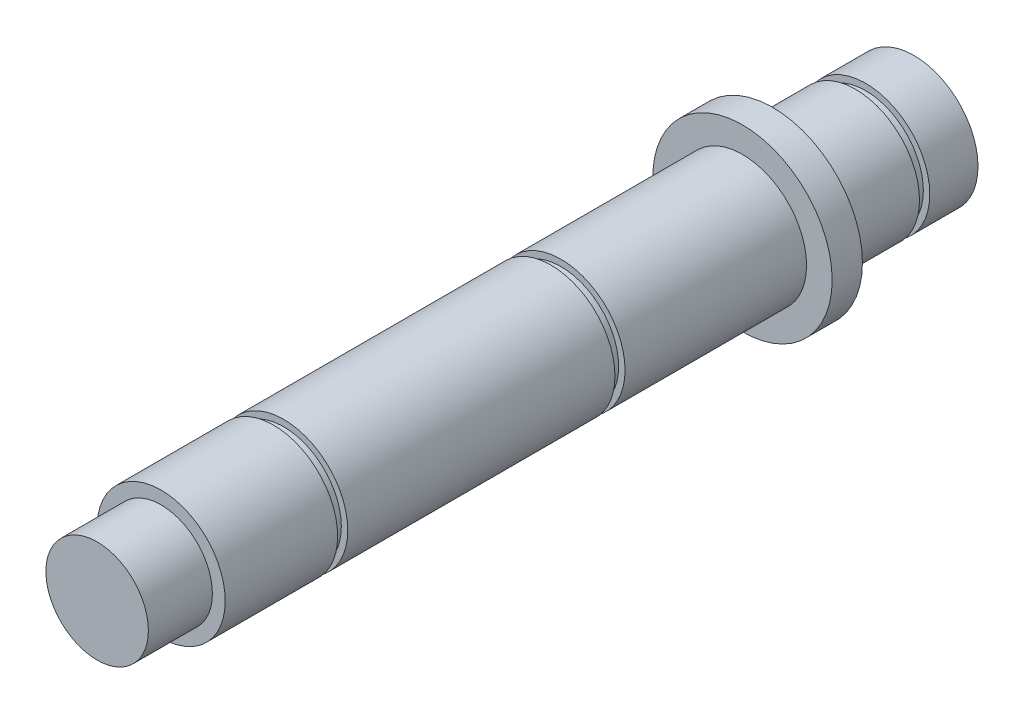
ISO-10303-21;
HEADER;
FILE_DESCRIPTION(('STEP AP214'),'2;1');
FILE_NAME('part.step','',(''),(''),'','','');
FILE_SCHEMA(('AUTOMOTIVE_DESIGN { 1 0 10303 214 1 1 1 1 }'));
ENDSEC;
DATA;
#1=APPLICATION_CONTEXT('core data for automotive mechanical design processes');
#2=APPLICATION_PROTOCOL_DEFINITION('international standard','automotive_design',2000,#1);
#3=PRODUCT_CONTEXT('',#1,'mechanical');
#4=PRODUCT('Part','Part','',(#3));
#5=PRODUCT_RELATED_PRODUCT_CATEGORY('part','',(#4));
#6=PRODUCT_DEFINITION_FORMATION('','',#4);
#7=PRODUCT_DEFINITION_CONTEXT('part definition',#1,'design');
#8=PRODUCT_DEFINITION('design','',#6,#7);
#9=PRODUCT_DEFINITION_SHAPE('','',#8);
#10=(LENGTH_UNIT() NAMED_UNIT(*) SI_UNIT(.MILLI.,.METRE.));
#11=(NAMED_UNIT(*) PLANE_ANGLE_UNIT() SI_UNIT($,.RADIAN.));
#12=(NAMED_UNIT(*) SI_UNIT($,.STERADIAN.) SOLID_ANGLE_UNIT());
#13=UNCERTAINTY_MEASURE_WITH_UNIT(LENGTH_MEASURE(1.E-05),#10,'distance_accuracy_value','');
#14=(GEOMETRIC_REPRESENTATION_CONTEXT(3) GLOBAL_UNCERTAINTY_ASSIGNED_CONTEXT((#13)) GLOBAL_UNIT_ASSIGNED_CONTEXT((#10,
#11,#12)) REPRESENTATION_CONTEXT('',''));
#15=CARTESIAN_POINT('',(0.,0.,0.));
#16=DIRECTION('',(0.,0.,1.));
#17=DIRECTION('',(1.,0.,0.));
#18=AXIS2_PLACEMENT_3D('',#15,#16,#17);
#19=CARTESIAN_POINT('',(0.,0.,-81.));
#20=DIRECTION('',(0.,0.,1.));
#21=DIRECTION('',(1.,0.,0.));
#22=AXIS2_PLACEMENT_3D('',#19,#20,#21);
#23=CYLINDRICAL_SURFACE('',#22,6.35);
#24=CARTESIAN_POINT('',(0.,0.,-64.));
#25=DIRECTION('',(0.,0.,1.));
#26=DIRECTION('',(1.,0.,0.));
#27=AXIS2_PLACEMENT_3D('',#24,#25,#26);
#28=CIRCLE('',#27,6.35);
#29=CARTESIAN_POINT('',(6.35,0.,-64.));
#30=VERTEX_POINT('',#29);
#31=EDGE_CURVE('E10',#30,#30,#28,.F.);
#32=ORIENTED_EDGE('',*,*,#31,.F.);
#33=EDGE_LOOP('',(#32));
#34=FACE_BOUND('',#33,.T.);
#35=CARTESIAN_POINT('',(0.,0.,-46.));
#36=DIRECTION('',(0.,0.,1.));
#37=DIRECTION('',(1.,0.,0.));
#38=AXIS2_PLACEMENT_3D('',#35,#36,#37);
#39=CIRCLE('',#38,6.35);
#40=CARTESIAN_POINT('',(6.35,0.,-46.));
#41=VERTEX_POINT('',#40);
#42=EDGE_CURVE('E35',#41,#41,#39,.F.);
#43=ORIENTED_EDGE('',*,*,#42,.T.);
#44=EDGE_LOOP('',(#43));
#45=FACE_BOUND('',#44,.T.);
#46=ADVANCED_FACE('F31',(#34,#45),#23,.T.);
#47=CARTESIAN_POINT('',(0.,0.,-75.2));
#48=DIRECTION('',(0.,0.,1.));
#49=DIRECTION('',(1.,0.,0.));
#50=AXIS2_PLACEMENT_3D('',#47,#48,#49);
#51=CIRCLE('',#50,6.35);
#52=CARTESIAN_POINT('',(6.35,0.,-75.2));
#53=VERTEX_POINT('',#52);
#54=EDGE_CURVE('E93',#53,#53,#51,.F.);
#55=ORIENTED_EDGE('',*,*,#54,.F.);
#56=EDGE_LOOP('',(#55));
#57=FACE_BOUND('',#56,.T.);
#58=CARTESIAN_POINT('',(0.,0.,-67.));
#59=DIRECTION('',(0.,0.,1.));
#60=DIRECTION('',(1.,0.,0.));
#61=AXIS2_PLACEMENT_3D('',#58,#59,#60);
#62=CIRCLE('',#61,6.35);
#63=CARTESIAN_POINT('',(6.35,0.,-67.));
#64=VERTEX_POINT('',#63);
#65=EDGE_CURVE('E48',#64,#64,#62,.F.);
#66=ORIENTED_EDGE('',*,*,#65,.T.);
#67=EDGE_LOOP('',(#66));
#68=FACE_BOUND('',#67,.T.);
#69=ADVANCED_FACE('F125',(#57,#68),#23,.T.);
#70=CARTESIAN_POINT('',(0.,0.,-81.));
#71=DIRECTION('',(0.,0.,1.));
#72=DIRECTION('',(1.,0.,0.));
#73=AXIS2_PLACEMENT_3D('',#70,#71,#72);
#74=CIRCLE('',#73,6.35);
#75=CARTESIAN_POINT('',(6.35,0.,-81.));
#76=VERTEX_POINT('',#75);
#77=EDGE_CURVE('E39',#76,#76,#74,.T.);
#78=ORIENTED_EDGE('',*,*,#77,.T.);
#79=EDGE_LOOP('',(#78));
#80=FACE_BOUND('',#79,.T.);
#81=CARTESIAN_POINT('',(0.,0.,-76.216));
#82=DIRECTION('',(0.,0.,1.));
#83=DIRECTION('',(1.,0.,0.));
#84=AXIS2_PLACEMENT_3D('',#81,#82,#83);
#85=CIRCLE('',#84,6.35);
#86=CARTESIAN_POINT('',(6.35,0.,-76.216));
#87=VERTEX_POINT('',#86);
#88=EDGE_CURVE('E44',#87,#87,#85,.F.);
#89=ORIENTED_EDGE('',*,*,#88,.T.);
#90=EDGE_LOOP('',(#89));
#91=FACE_BOUND('',#90,.T.);
#92=ADVANCED_FACE('F101',(#80,#91),#23,.T.);
#93=CARTESIAN_POINT('',(0.,0.,-81.));
#94=DIRECTION('',(0.,0.,1.));
#95=DIRECTION('',(1.,0.,0.));
#96=AXIS2_PLACEMENT_3D('',#93,#94,#95);
#97=PLANE('',#96);
#98=ORIENTED_EDGE('',*,*,#77,.F.);
#99=EDGE_LOOP('',(#98));
#100=FACE_BOUND('',#99,.T.);
#101=ADVANCED_FACE('F107',(#100),#97,.F.);
#102=CARTESIAN_POINT('',(0.0490374855015747,0.,-76.216));
#103=DIRECTION('',(0.,0.,1.));
#104=DIRECTION('',(1.,0.,0.));
#105=AXIS2_PLACEMENT_3D('',#102,#103,#104);
#106=PLANE('',#105);
#107=ORIENTED_EDGE('',*,*,#88,.F.);
#108=EDGE_LOOP('',(#107));
#109=FACE_BOUND('',#108,.T.);
#110=CARTESIAN_POINT('',(0.,0.,-76.216));
#111=DIRECTION('',(0.,0.,1.));
#112=DIRECTION('',(1.,0.,0.));
#113=AXIS2_PLACEMENT_3D('',#110,#111,#112);
#114=CIRCLE('',#113,5.715);
#115=CARTESIAN_POINT('',(5.715,0.,-76.216));
#116=VERTEX_POINT('',#115);
#117=EDGE_CURVE('E90',#116,#116,#114,.T.);
#118=ORIENTED_EDGE('',*,*,#117,.F.);
#119=EDGE_LOOP('',(#118));
#120=FACE_BOUND('',#119,.T.);
#121=ADVANCED_FACE('F103',(#109,#120),#106,.T.);
#122=CARTESIAN_POINT('',(0.0490374855015747,0.,-75.2));
#123=DIRECTION('',(0.,0.,1.));
#124=DIRECTION('',(1.,0.,0.));
#125=AXIS2_PLACEMENT_3D('',#122,#123,#124);
#126=PLANE('',#125);
#127=ORIENTED_EDGE('',*,*,#54,.T.);
#128=EDGE_LOOP('',(#127));
#129=FACE_BOUND('',#128,.T.);
#130=CARTESIAN_POINT('',(0.,0.,-75.2));
#131=DIRECTION('',(0.,0.,1.));
#132=DIRECTION('',(1.,0.,0.));
#133=AXIS2_PLACEMENT_3D('',#130,#131,#132);
#134=CIRCLE('',#133,5.715);
#135=CARTESIAN_POINT('',(5.715,0.,-75.2));
#136=VERTEX_POINT('',#135);
#137=EDGE_CURVE('E94',#136,#136,#134,.T.);
#138=ORIENTED_EDGE('',*,*,#137,.T.);
#139=EDGE_LOOP('',(#138));
#140=FACE_BOUND('',#139,.T.);
#141=ADVANCED_FACE('F106',(#129,#140),#126,.F.);
#142=CARTESIAN_POINT('',(0.,0.,-76.216));
#143=DIRECTION('',(0.,0.,1.));
#144=DIRECTION('',(1.,0.,0.));
#145=AXIS2_PLACEMENT_3D('',#142,#143,#144);
#146=CYLINDRICAL_SURFACE('',#145,5.715);
#147=ORIENTED_EDGE('',*,*,#117,.T.);
#148=EDGE_LOOP('',(#147));
#149=FACE_BOUND('',#148,.T.);
#150=ORIENTED_EDGE('',*,*,#137,.F.);
#151=EDGE_LOOP('',(#150));
#152=FACE_BOUND('',#151,.T.);
#153=ADVANCED_FACE('F111',(#149,#152),#146,.T.);
#154=CARTESIAN_POINT('',(0.,0.,-64.));
#155=DIRECTION('',(0.,0.,-1.));
#156=DIRECTION('',(-1.,0.,0.));
#157=AXIS2_PLACEMENT_3D('',#154,#155,#156);
#158=CYLINDRICAL_SURFACE('',#157,8.89);
#159=CARTESIAN_POINT('',(0.,0.,-64.));
#160=DIRECTION('',(0.,0.,1.));
#161=DIRECTION('',(1.,0.,0.));
#162=AXIS2_PLACEMENT_3D('',#159,#160,#161);
#163=CIRCLE('',#162,8.89);
#164=CARTESIAN_POINT('',(8.89,0.,-64.));
#165=VERTEX_POINT('',#164);
#166=EDGE_CURVE('E85',#165,#165,#163,.T.);
#167=ORIENTED_EDGE('',*,*,#166,.F.);
#168=EDGE_LOOP('',(#167));
#169=FACE_BOUND('',#168,.T.);
#170=CARTESIAN_POINT('',(0.,0.,-67.));
#171=DIRECTION('',(0.,0.,1.));
#172=DIRECTION('',(1.,0.,0.));
#173=AXIS2_PLACEMENT_3D('',#170,#171,#172);
#174=CIRCLE('',#173,8.89);
#175=CARTESIAN_POINT('',(8.89,0.,-67.));
#176=VERTEX_POINT('',#175);
#177=EDGE_CURVE('E53',#176,#176,#174,.T.);
#178=ORIENTED_EDGE('',*,*,#177,.T.);
#179=EDGE_LOOP('',(#178));
#180=FACE_BOUND('',#179,.T.);
#181=ADVANCED_FACE('F114',(#169,#180),#158,.T.);
#182=CARTESIAN_POINT('',(0.,0.,-64.));
#183=DIRECTION('',(0.,0.,1.));
#184=DIRECTION('',(1.,0.,0.));
#185=AXIS2_PLACEMENT_3D('',#182,#183,#184);
#186=PLANE('',#185);
#187=ORIENTED_EDGE('',*,*,#31,.T.);
#188=EDGE_LOOP('',(#187));
#189=FACE_BOUND('',#188,.T.);
#190=ORIENTED_EDGE('',*,*,#166,.T.);
#191=EDGE_LOOP('',(#190));
#192=FACE_BOUND('',#191,.T.);
#193=ADVANCED_FACE('F192',(#189,#192),#186,.T.);
#194=CARTESIAN_POINT('',(0.,0.,-67.));
#195=DIRECTION('',(0.,0.,1.));
#196=DIRECTION('',(1.,0.,0.));
#197=AXIS2_PLACEMENT_3D('',#194,#195,#196);
#198=PLANE('',#197);
#199=ORIENTED_EDGE('',*,*,#65,.F.);
#200=EDGE_LOOP('',(#199));
#201=FACE_BOUND('',#200,.T.);
#202=ORIENTED_EDGE('',*,*,#177,.F.);
#203=EDGE_LOOP('',(#202));
#204=FACE_BOUND('',#203,.T.);
#205=ADVANCED_FACE('F183',(#201,#204),#198,.F.);
#206=CARTESIAN_POINT('',(0.,0.,-46.));
#207=DIRECTION('',(0.,0.,1.));
#208=DIRECTION('',(1.,0.,0.));
#209=AXIS2_PLACEMENT_3D('',#206,#207,#208);
#210=PLANE('',#209);
#211=ORIENTED_EDGE('',*,*,#42,.F.);
#212=EDGE_LOOP('',(#211));
#213=FACE_BOUND('',#212,.T.);
#214=CARTESIAN_POINT('',(0.,0.,-46.));
#215=DIRECTION('',(0.,0.,1.));
#216=DIRECTION('',(1.,0.,0.));
#217=AXIS2_PLACEMENT_3D('',#214,#215,#216);
#218=CIRCLE('',#217,5.715);
#219=CARTESIAN_POINT('',(5.715,0.,-46.));
#220=VERTEX_POINT('',#219);
#221=EDGE_CURVE('E64',#220,#220,#218,.T.);
#222=ORIENTED_EDGE('',*,*,#221,.F.);
#223=EDGE_LOOP('',(#222));
#224=FACE_BOUND('',#223,.T.);
#225=ADVANCED_FACE('F178',(#213,#224),#210,.T.);
#226=CARTESIAN_POINT('',(0.,0.,-45.));
#227=DIRECTION('',(0.,0.,1.));
#228=DIRECTION('',(1.,0.,0.));
#229=AXIS2_PLACEMENT_3D('',#226,#227,#228);
#230=PLANE('',#229);
#231=CARTESIAN_POINT('',(0.,0.,-45.));
#232=DIRECTION('',(0.,0.,1.));
#233=DIRECTION('',(1.,0.,0.));
#234=AXIS2_PLACEMENT_3D('',#231,#232,#233);
#235=CIRCLE('',#234,6.35);
#236=CARTESIAN_POINT('',(6.35,0.,-45.));
#237=VERTEX_POINT('',#236);
#238=EDGE_CURVE('E62',#237,#237,#235,.F.);
#239=ORIENTED_EDGE('',*,*,#238,.T.);
#240=EDGE_LOOP('',(#239));
#241=FACE_BOUND('',#240,.T.);
#242=CARTESIAN_POINT('',(0.,0.,-45.));
#243=DIRECTION('',(0.,0.,1.));
#244=DIRECTION('',(1.,0.,0.));
#245=AXIS2_PLACEMENT_3D('',#242,#243,#244);
#246=CIRCLE('',#245,5.715);
#247=CARTESIAN_POINT('',(5.715,0.,-45.));
#248=VERTEX_POINT('',#247);
#249=EDGE_CURVE('E70',#248,#248,#246,.T.);
#250=ORIENTED_EDGE('',*,*,#249,.T.);
#251=EDGE_LOOP('',(#250));
#252=FACE_BOUND('',#251,.T.);
#253=ADVANCED_FACE('F171',(#241,#252),#230,.F.);
#254=CARTESIAN_POINT('',(0.,0.,-46.));
#255=DIRECTION('',(0.,0.,1.));
#256=DIRECTION('',(1.,0.,0.));
#257=AXIS2_PLACEMENT_3D('',#254,#255,#256);
#258=CYLINDRICAL_SURFACE('',#257,5.715);
#259=ORIENTED_EDGE('',*,*,#221,.T.);
#260=EDGE_LOOP('',(#259));
#261=FACE_BOUND('',#260,.T.);
#262=ORIENTED_EDGE('',*,*,#249,.F.);
#263=EDGE_LOOP('',(#262));
#264=FACE_BOUND('',#263,.T.);
#265=ADVANCED_FACE('F163',(#261,#264),#258,.T.);
#266=CARTESIAN_POINT('',(0.,0.,0.));
#267=DIRECTION('',(0.,0.,1.));
#268=DIRECTION('',(1.,0.,0.));
#269=AXIS2_PLACEMENT_3D('',#266,#267,#268);
#270=PLANE('',#269);
#271=CARTESIAN_POINT('',(0.,0.,0.));
#272=DIRECTION('',(0.,0.,1.));
#273=DIRECTION('',(1.,0.,0.));
#274=AXIS2_PLACEMENT_3D('',#271,#272,#273);
#275=CIRCLE('',#274,5.08);
#276=CARTESIAN_POINT('',(5.08,0.,0.));
#277=VERTEX_POINT('',#276);
#278=EDGE_CURVE('E61',#277,#277,#275,.T.);
#279=ORIENTED_EDGE('',*,*,#278,.T.);
#280=EDGE_LOOP('',(#279));
#281=FACE_BOUND('',#280,.T.);
#282=ADVANCED_FACE('F161',(#281),#270,.T.);
#283=CARTESIAN_POINT('',(0.,0.,-6.35));
#284=DIRECTION('',(0.,0.,1.));
#285=DIRECTION('',(1.,0.,0.));
#286=AXIS2_PLACEMENT_3D('',#283,#284,#285);
#287=CYLINDRICAL_SURFACE('',#286,5.08);
#288=CARTESIAN_POINT('',(0.,0.,-6.35));
#289=DIRECTION('',(0.,0.,1.));
#290=DIRECTION('',(1.,0.,0.));
#291=AXIS2_PLACEMENT_3D('',#288,#289,#290);
#292=CIRCLE('',#291,5.08);
#293=CARTESIAN_POINT('',(5.08,0.,-6.35));
#294=VERTEX_POINT('',#293);
#295=EDGE_CURVE('E54',#294,#294,#292,.T.);
#296=ORIENTED_EDGE('',*,*,#295,.T.);
#297=EDGE_LOOP('',(#296));
#298=FACE_BOUND('',#297,.T.);
#299=ORIENTED_EDGE('',*,*,#278,.F.);
#300=EDGE_LOOP('',(#299));
#301=FACE_BOUND('',#300,.T.);
#302=ADVANCED_FACE('F147',(#298,#301),#287,.T.);
#303=CARTESIAN_POINT('',(0.,0.,-6.35));
#304=DIRECTION('',(0.,0.,1.));
#305=DIRECTION('',(1.,0.,0.));
#306=AXIS2_PLACEMENT_3D('',#303,#304,#305);
#307=PLANE('',#306);
#308=CARTESIAN_POINT('',(0.,0.,-6.34999999999999));
#309=DIRECTION('',(0.,0.,1.));
#310=DIRECTION('',(1.,0.,0.));
#311=AXIS2_PLACEMENT_3D('',#308,#309,#310);
#312=CIRCLE('',#311,6.35);
#313=CARTESIAN_POINT('',(6.35,0.,-6.34999999999999));
#314=VERTEX_POINT('',#313);
#315=EDGE_CURVE('E50',#314,#314,#312,.F.);
#316=ORIENTED_EDGE('',*,*,#315,.F.);
#317=EDGE_LOOP('',(#316));
#318=FACE_BOUND('',#317,.T.);
#319=ORIENTED_EDGE('',*,*,#295,.F.);
#320=EDGE_LOOP('',(#319));
#321=FACE_BOUND('',#320,.T.);
#322=ADVANCED_FACE('F138',(#318,#321),#307,.T.);
#323=CARTESIAN_POINT('',(0.,0.,-17.5));
#324=DIRECTION('',(0.,0.,1.));
#325=DIRECTION('',(1.,0.,0.));
#326=AXIS2_PLACEMENT_3D('',#323,#324,#325);
#327=CIRCLE('',#326,6.35);
#328=CARTESIAN_POINT('',(6.35,0.,-17.5));
#329=VERTEX_POINT('',#328);
#330=EDGE_CURVE('E55',#329,#329,#327,.F.);
#331=ORIENTED_EDGE('',*,*,#330,.F.);
#332=EDGE_LOOP('',(#331));
#333=FACE_BOUND('',#332,.T.);
#334=ORIENTED_EDGE('',*,*,#315,.T.);
#335=EDGE_LOOP('',(#334));
#336=FACE_BOUND('',#335,.T.);
#337=ADVANCED_FACE('F33',(#333,#336),#23,.T.);
#338=CARTESIAN_POINT('',(0.,0.,-17.5));
#339=DIRECTION('',(0.,0.,1.));
#340=DIRECTION('',(1.,0.,0.));
#341=AXIS2_PLACEMENT_3D('',#338,#339,#340);
#342=PLANE('',#341);
#343=ORIENTED_EDGE('',*,*,#330,.T.);
#344=EDGE_LOOP('',(#343));
#345=FACE_BOUND('',#344,.T.);
#346=CARTESIAN_POINT('',(0.,0.,-17.5));
#347=DIRECTION('',(0.,0.,1.));
#348=DIRECTION('',(1.,0.,0.));
#349=AXIS2_PLACEMENT_3D('',#346,#347,#348);
#350=CIRCLE('',#349,5.715);
#351=CARTESIAN_POINT('',(5.715,0.,-17.5));
#352=VERTEX_POINT('',#351);
#353=EDGE_CURVE('E68',#352,#352,#350,.T.);
#354=ORIENTED_EDGE('',*,*,#353,.T.);
#355=EDGE_LOOP('',(#354));
#356=FACE_BOUND('',#355,.T.);
#357=ADVANCED_FACE('F137',(#345,#356),#342,.F.);
#358=CARTESIAN_POINT('',(0.,0.,-18.5));
#359=DIRECTION('',(0.,0.,1.));
#360=DIRECTION('',(1.,0.,0.));
#361=AXIS2_PLACEMENT_3D('',#358,#359,#360);
#362=CYLINDRICAL_SURFACE('',#361,5.715);
#363=CARTESIAN_POINT('',(0.,0.,-18.5));
#364=DIRECTION('',(0.,0.,1.));
#365=DIRECTION('',(1.,0.,0.));
#366=AXIS2_PLACEMENT_3D('',#363,#364,#365);
#367=CIRCLE('',#366,5.715);
#368=CARTESIAN_POINT('',(5.715,0.,-18.5));
#369=VERTEX_POINT('',#368);
#370=EDGE_CURVE('E59',#369,#369,#367,.T.);
#371=ORIENTED_EDGE('',*,*,#370,.T.);
#372=EDGE_LOOP('',(#371));
#373=FACE_BOUND('',#372,.T.);
#374=ORIENTED_EDGE('',*,*,#353,.F.);
#375=EDGE_LOOP('',(#374));
#376=FACE_BOUND('',#375,.T.);
#377=ADVANCED_FACE('F144',(#373,#376),#362,.T.);
#378=CARTESIAN_POINT('',(0.,0.,-18.5));
#379=DIRECTION('',(0.,0.,1.));
#380=DIRECTION('',(1.,0.,0.));
#381=AXIS2_PLACEMENT_3D('',#378,#379,#380);
#382=PLANE('',#381);
#383=CARTESIAN_POINT('',(0.,0.,-18.5));
#384=DIRECTION('',(0.,0.,1.));
#385=DIRECTION('',(1.,0.,0.));
#386=AXIS2_PLACEMENT_3D('',#383,#384,#385);
#387=CIRCLE('',#386,6.35);
#388=CARTESIAN_POINT('',(6.35,0.,-18.5));
#389=VERTEX_POINT('',#388);
#390=EDGE_CURVE('E58',#389,#389,#387,.F.);
#391=ORIENTED_EDGE('',*,*,#390,.F.);
#392=EDGE_LOOP('',(#391));
#393=FACE_BOUND('',#392,.T.);
#394=ORIENTED_EDGE('',*,*,#370,.F.);
#395=EDGE_LOOP('',(#394));
#396=FACE_BOUND('',#395,.T.);
#397=ADVANCED_FACE('F134',(#393,#396),#382,.T.);
#398=ORIENTED_EDGE('',*,*,#238,.F.);
#399=EDGE_LOOP('',(#398));
#400=FACE_BOUND('',#399,.T.);
#401=ORIENTED_EDGE('',*,*,#390,.T.);
#402=EDGE_LOOP('',(#401));
#403=FACE_BOUND('',#402,.T.);
#404=ADVANCED_FACE('F127',(#400,#403),#23,.T.);
#405=CLOSED_SHELL('',(#46,#69,#92,#101,#121,#141,#153,#181,#193,#205,#225,#253,#265,#282,#302,
#322,#337,#357,#377,#397,#404));
#406=MANIFOLD_SOLID_BREP('B2',#405);
#407=ADVANCED_BREP_SHAPE_REPRESENTATION('',(#18,#406),#14);
#408=SHAPE_DEFINITION_REPRESENTATION(#9,#407);
ENDSEC;
END-ISO-10303-21;
